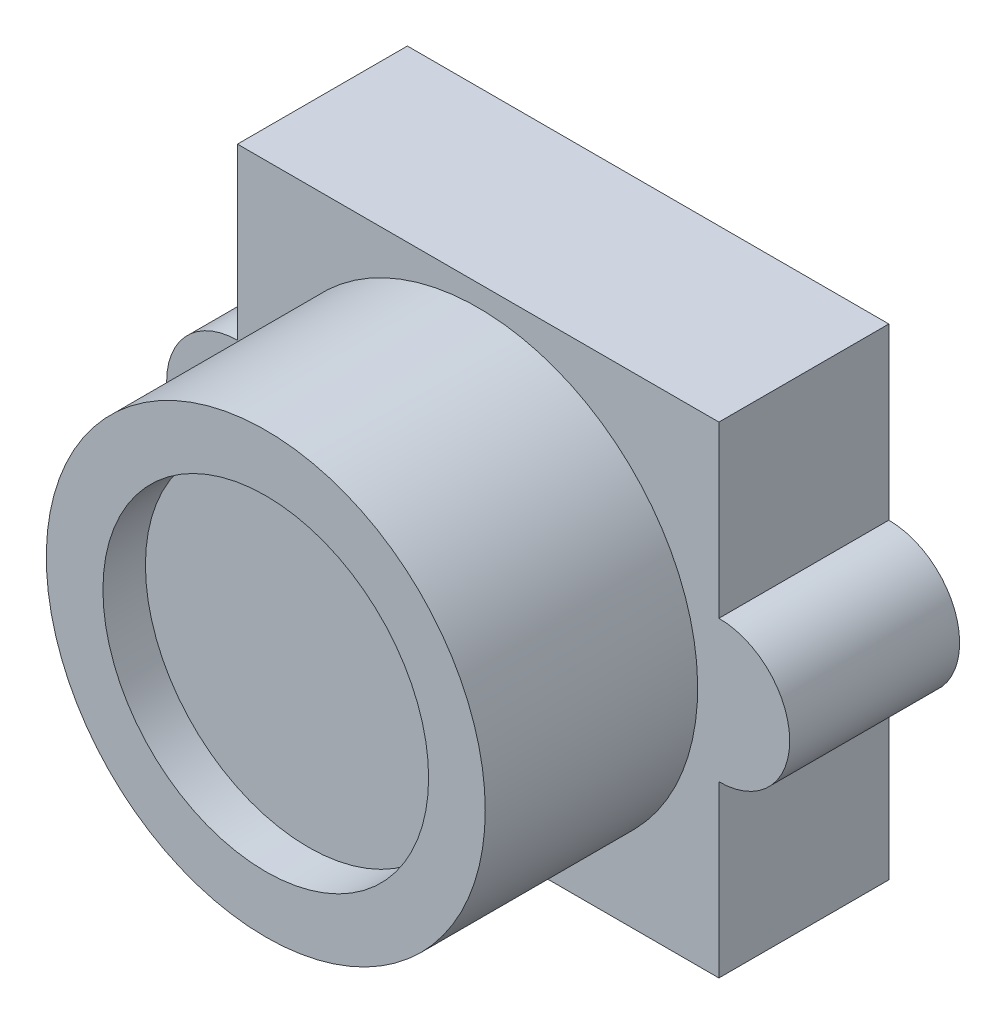
ISO-10303-21;
HEADER;
FILE_DESCRIPTION(('STEP AP214'),'2;1');
FILE_NAME('part.step','',(''),(''),'','','');
FILE_SCHEMA(('AUTOMOTIVE_DESIGN { 1 0 10303 214 1 1 1 1 }'));
ENDSEC;
DATA;
#1=APPLICATION_CONTEXT('core data for automotive mechanical design processes');
#2=APPLICATION_PROTOCOL_DEFINITION('international standard','automotive_design',2000,#1);
#3=PRODUCT_CONTEXT('',#1,'mechanical');
#4=PRODUCT('Part','Part','',(#3));
#5=PRODUCT_RELATED_PRODUCT_CATEGORY('part','',(#4));
#6=PRODUCT_DEFINITION_FORMATION('','',#4);
#7=PRODUCT_DEFINITION_CONTEXT('part definition',#1,'design');
#8=PRODUCT_DEFINITION('design','',#6,#7);
#9=PRODUCT_DEFINITION_SHAPE('','',#8);
#10=(LENGTH_UNIT() NAMED_UNIT(*) SI_UNIT(.MILLI.,.METRE.));
#11=(NAMED_UNIT(*) PLANE_ANGLE_UNIT() SI_UNIT($,.RADIAN.));
#12=(NAMED_UNIT(*) SI_UNIT($,.STERADIAN.) SOLID_ANGLE_UNIT());
#13=UNCERTAINTY_MEASURE_WITH_UNIT(LENGTH_MEASURE(1.E-05),#10,'distance_accuracy_value','');
#14=(GEOMETRIC_REPRESENTATION_CONTEXT(3) GLOBAL_UNCERTAINTY_ASSIGNED_CONTEXT((#13)) GLOBAL_UNIT_ASSIGNED_CONTEXT((#10,
#11,#12)) REPRESENTATION_CONTEXT('',''));
#15=CARTESIAN_POINT('',(0.,0.,0.));
#16=DIRECTION('',(0.,0.,1.));
#17=DIRECTION('',(1.,0.,0.));
#18=AXIS2_PLACEMENT_3D('',#15,#16,#17);
#19=CARTESIAN_POINT('',(0.,-2.9025,9.5275));
#20=DIRECTION('',(0.,0.,-1.));
#21=DIRECTION('',(-1.,0.,0.));
#22=AXIS2_PLACEMENT_3D('',#19,#20,#21);
#23=CYLINDRICAL_SURFACE('',#22,3.88125);
#24=CARTESIAN_POINT('',(0.,-2.9025,7.005));
#25=DIRECTION('',(0.,0.,1.));
#26=DIRECTION('',(1.,0.,0.));
#27=AXIS2_PLACEMENT_3D('',#24,#25,#26);
#28=CIRCLE('',#27,3.88125);
#29=CARTESIAN_POINT('',(3.88125,-2.9025,7.005));
#30=VERTEX_POINT('',#29);
#31=EDGE_CURVE('E54',#30,#30,#28,.T.);
#32=ORIENTED_EDGE('',*,*,#31,.T.);
#33=EDGE_LOOP('',(#32));
#34=FACE_BOUND('',#33,.T.);
#35=CARTESIAN_POINT('',(0.,-2.9025,8.505));
#36=DIRECTION('',(0.,0.,1.));
#37=DIRECTION('',(0.,-1.,0.));
#38=AXIS2_PLACEMENT_3D('',#35,#36,#37);
#39=CIRCLE('',#38,3.88125);
#40=CARTESIAN_POINT('',(0.,-6.78375,8.505));
#41=VERTEX_POINT('',#40);
#42=EDGE_CURVE('E11',#41,#41,#39,.T.);
#43=ORIENTED_EDGE('',*,*,#42,.F.);
#44=EDGE_LOOP('',(#43));
#45=FACE_BOUND('',#44,.T.);
#46=ADVANCED_FACE('F51',(#34,#45),#23,.T.);
#47=CARTESIAN_POINT('',(0.,-2.9025,7.005));
#48=DIRECTION('',(0.,0.,1.));
#49=DIRECTION('',(1.,0.,0.));
#50=AXIS2_PLACEMENT_3D('',#47,#48,#49);
#51=PLANE('',#50);
#52=ORIENTED_EDGE('',*,*,#31,.F.);
#53=EDGE_LOOP('',(#52));
#54=FACE_BOUND('',#53,.T.);
#55=ADVANCED_FACE('F65',(#54),#51,.F.);
#56=CARTESIAN_POINT('',(0.,-2.9025,8.505));
#57=DIRECTION('',(0.,0.,1.));
#58=DIRECTION('',(1.,0.,0.));
#59=AXIS2_PLACEMENT_3D('',#56,#57,#58);
#60=PLANE('',#59);
#61=ORIENTED_EDGE('',*,*,#42,.T.);
#62=EDGE_LOOP('',(#61));
#63=FACE_BOUND('',#62,.T.);
#64=ADVANCED_FACE('F67',(#63),#60,.T.);
#65=CLOSED_SHELL('',(#46,#55,#64));
#66=MANIFOLD_SOLID_BREP('B2',#65);
#67=CARTESIAN_POINT('',(-5.7375,-2.9025,4.455));
#68=DIRECTION('',(0.,0.,1.));
#69=DIRECTION('',(1.,0.,0.));
#70=AXIS2_PLACEMENT_3D('',#67,#68,#69);
#71=PLANE('',#70);
#72=CARTESIAN_POINT('',(0.,-2.9025,4.455));
#73=DIRECTION('',(0.,0.,1.));
#74=DIRECTION('',(0.,-1.,0.));
#75=AXIS2_PLACEMENT_3D('',#72,#73,#74);
#76=CIRCLE('',#75,5.23125);
#77=CARTESIAN_POINT('',(0.,-8.13375,4.455));
#78=VERTEX_POINT('',#77);
#79=EDGE_CURVE('E215',#78,#78,#76,.T.);
#80=ORIENTED_EDGE('',*,*,#79,.F.);
#81=EDGE_LOOP('',(#80));
#82=FACE_BOUND('',#81,.T.);
#83=DIRECTION('',(0.,1.,0.));
#84=VECTOR('',#83,1.);
#85=CARTESIAN_POINT('',(5.7375,-1.215,4.455));
#86=LINE('',#85,#84);
#87=CARTESIAN_POINT('',(5.7375,-1.215,4.455));
#88=VERTEX_POINT('',#87);
#89=CARTESIAN_POINT('',(5.7375,2.835,4.455));
#90=VERTEX_POINT('',#89);
#91=EDGE_CURVE('E238',#88,#90,#86,.T.);
#92=ORIENTED_EDGE('',*,*,#91,.T.);
#93=DIRECTION('',(-1.,0.,0.));
#94=VECTOR('',#93,1.);
#95=CARTESIAN_POINT('',(-5.7375,2.835,4.455));
#96=LINE('',#95,#94);
#97=CARTESIAN_POINT('',(-5.7375,2.835,4.455));
#98=VERTEX_POINT('',#97);
#99=EDGE_CURVE('E173',#90,#98,#96,.T.);
#100=ORIENTED_EDGE('',*,*,#99,.T.);
#101=DIRECTION('',(0.,-1.,0.));
#102=VECTOR('',#101,1.);
#103=CARTESIAN_POINT('',(-5.7375,-1.215,4.455));
#104=LINE('',#103,#102);
#105=CARTESIAN_POINT('',(-5.7375,-1.215,4.455));
#106=VERTEX_POINT('',#105);
#107=EDGE_CURVE('E242',#98,#106,#104,.T.);
#108=ORIENTED_EDGE('',*,*,#107,.T.);
#109=CARTESIAN_POINT('',(-5.7375,-2.9025,4.455));
#110=DIRECTION('',(0.,0.,1.));
#111=DIRECTION('',(1.,0.,0.));
#112=AXIS2_PLACEMENT_3D('',#109,#110,#111);
#113=CIRCLE('',#112,1.6875);
#114=CARTESIAN_POINT('',(-5.7375,-4.59,4.455));
#115=VERTEX_POINT('',#114);
#116=EDGE_CURVE('E249',#106,#115,#113,.T.);
#117=ORIENTED_EDGE('',*,*,#116,.T.);
#118=DIRECTION('',(0.,-1.,0.));
#119=VECTOR('',#118,1.);
#120=CARTESIAN_POINT('',(-5.7375,-8.64,4.455));
#121=LINE('',#120,#119);
#122=CARTESIAN_POINT('',(-5.7375,-8.64,4.455));
#123=VERTEX_POINT('',#122);
#124=EDGE_CURVE('E191',#115,#123,#121,.T.);
#125=ORIENTED_EDGE('',*,*,#124,.T.);
#126=DIRECTION('',(1.,0.,0.));
#127=VECTOR('',#126,1.);
#128=CARTESIAN_POINT('',(-5.7375,-8.64,4.455));
#129=LINE('',#128,#127);
#130=CARTESIAN_POINT('',(5.7375,-8.64,4.455));
#131=VERTEX_POINT('',#130);
#132=EDGE_CURVE('E186',#123,#131,#129,.T.);
#133=ORIENTED_EDGE('',*,*,#132,.T.);
#134=DIRECTION('',(0.,1.,0.));
#135=VECTOR('',#134,1.);
#136=CARTESIAN_POINT('',(5.7375,-8.64,4.455));
#137=LINE('',#136,#135);
#138=CARTESIAN_POINT('',(5.7375,-4.59,4.455));
#139=VERTEX_POINT('',#138);
#140=EDGE_CURVE('E189',#131,#139,#137,.T.);
#141=ORIENTED_EDGE('',*,*,#140,.T.);
#142=CARTESIAN_POINT('',(5.7375,-2.9025,4.455));
#143=DIRECTION('',(0.,0.,1.));
#144=DIRECTION('',(1.,0.,0.));
#145=AXIS2_PLACEMENT_3D('',#142,#143,#144);
#146=CIRCLE('',#145,1.6875);
#147=EDGE_CURVE('E130',#139,#88,#146,.T.);
#148=ORIENTED_EDGE('',*,*,#147,.T.);
#149=EDGE_LOOP('',(#92,#100,#108,#117,#125,#133,#141,#148));
#150=FACE_BOUND('',#149,.T.);
#151=ADVANCED_FACE('F111',(#82,#150),#71,.T.);
#152=CARTESIAN_POINT('',(-5.7375,2.835,4.455));
#153=DIRECTION('',(0.,-1.,0.));
#154=DIRECTION('',(0.,0.,-1.));
#155=AXIS2_PLACEMENT_3D('',#152,#153,#154);
#156=PLANE('',#155);
#157=DIRECTION('',(-1.,0.,0.));
#158=VECTOR('',#157,1.);
#159=CARTESIAN_POINT('',(-5.7375,2.835,0.405));
#160=LINE('',#159,#158);
#161=CARTESIAN_POINT('',(5.7375,2.835,0.405));
#162=VERTEX_POINT('',#161);
#163=CARTESIAN_POINT('',(-5.7375,2.835,0.405));
#164=VERTEX_POINT('',#163);
#165=EDGE_CURVE('E212',#162,#164,#160,.T.);
#166=ORIENTED_EDGE('',*,*,#165,.T.);
#167=DIRECTION('',(0.,0.,-1.));
#168=VECTOR('',#167,1.);
#169=CARTESIAN_POINT('',(-5.7375,2.835,4.455));
#170=LINE('',#169,#168);
#171=EDGE_CURVE('E216',#98,#164,#170,.T.);
#172=ORIENTED_EDGE('',*,*,#171,.F.);
#173=ORIENTED_EDGE('',*,*,#99,.F.);
#174=DIRECTION('',(0.,0.,-1.));
#175=VECTOR('',#174,1.);
#176=CARTESIAN_POINT('',(5.7375,2.835,4.455));
#177=LINE('',#176,#175);
#178=EDGE_CURVE('E213',#90,#162,#177,.T.);
#179=ORIENTED_EDGE('',*,*,#178,.T.);
#180=EDGE_LOOP('',(#166,#172,#173,#179));
#181=FACE_BOUND('',#180,.T.);
#182=ADVANCED_FACE('F263',(#181),#156,.F.);
#183=CARTESIAN_POINT('',(-5.7375,-1.215,4.455));
#184=DIRECTION('',(1.,0.,0.));
#185=DIRECTION('',(0.,1.,0.));
#186=AXIS2_PLACEMENT_3D('',#183,#184,#185);
#187=PLANE('',#186);
#188=DIRECTION('',(0.,-1.,0.));
#189=VECTOR('',#188,1.);
#190=CARTESIAN_POINT('',(-5.7375,-1.215,0.405));
#191=LINE('',#190,#189);
#192=CARTESIAN_POINT('',(-5.7375,-1.215,0.405));
#193=VERTEX_POINT('',#192);
#194=EDGE_CURVE('E219',#164,#193,#191,.T.);
#195=ORIENTED_EDGE('',*,*,#194,.T.);
#196=DIRECTION('',(0.,0.,-1.));
#197=VECTOR('',#196,1.);
#198=CARTESIAN_POINT('',(-5.7375,-1.215,4.455));
#199=LINE('',#198,#197);
#200=EDGE_CURVE('E222',#106,#193,#199,.T.);
#201=ORIENTED_EDGE('',*,*,#200,.F.);
#202=ORIENTED_EDGE('',*,*,#107,.F.);
#203=ORIENTED_EDGE('',*,*,#171,.T.);
#204=EDGE_LOOP('',(#195,#201,#202,#203));
#205=FACE_BOUND('',#204,.T.);
#206=ADVANCED_FACE('F262',(#205),#187,.F.);
#207=CARTESIAN_POINT('',(-5.7375,-2.9025,4.455));
#208=DIRECTION('',(0.,0.,-1.));
#209=DIRECTION('',(0.,1.,0.));
#210=AXIS2_PLACEMENT_3D('',#207,#208,#209);
#211=CYLINDRICAL_SURFACE('',#210,1.6875);
#212=CARTESIAN_POINT('',(-5.7375,-2.9025,0.405));
#213=DIRECTION('',(0.,0.,1.));
#214=DIRECTION('',(1.,0.,0.));
#215=AXIS2_PLACEMENT_3D('',#212,#213,#214);
#216=CIRCLE('',#215,1.6875);
#217=CARTESIAN_POINT('',(-5.7375,-4.59,0.405));
#218=VERTEX_POINT('',#217);
#219=EDGE_CURVE('E224',#193,#218,#216,.T.);
#220=ORIENTED_EDGE('',*,*,#219,.T.);
#221=DIRECTION('',(0.,0.,-1.));
#222=VECTOR('',#221,1.);
#223=CARTESIAN_POINT('',(-5.7375,-4.59,4.455));
#224=LINE('',#223,#222);
#225=EDGE_CURVE('E227',#115,#218,#224,.T.);
#226=ORIENTED_EDGE('',*,*,#225,.F.);
#227=ORIENTED_EDGE('',*,*,#116,.F.);
#228=ORIENTED_EDGE('',*,*,#200,.T.);
#229=EDGE_LOOP('',(#220,#226,#227,#228));
#230=FACE_BOUND('',#229,.T.);
#231=ADVANCED_FACE('F255',(#230),#211,.T.);
#232=CARTESIAN_POINT('',(-5.7375,-8.64,4.455));
#233=DIRECTION('',(1.,0.,0.));
#234=DIRECTION('',(0.,1.,0.));
#235=AXIS2_PLACEMENT_3D('',#232,#233,#234);
#236=PLANE('',#235);
#237=DIRECTION('',(0.,-1.,0.));
#238=VECTOR('',#237,1.);
#239=CARTESIAN_POINT('',(-5.7375,-8.64,0.405));
#240=LINE('',#239,#238);
#241=CARTESIAN_POINT('',(-5.7375,-8.64,0.405));
#242=VERTEX_POINT('',#241);
#243=EDGE_CURVE('E229',#218,#242,#240,.T.);
#244=ORIENTED_EDGE('',*,*,#243,.T.);
#245=DIRECTION('',(0.,0.,-1.));
#246=VECTOR('',#245,1.);
#247=CARTESIAN_POINT('',(-5.7375,-8.64,4.455));
#248=LINE('',#247,#246);
#249=EDGE_CURVE('E200',#123,#242,#248,.T.);
#250=ORIENTED_EDGE('',*,*,#249,.F.);
#251=ORIENTED_EDGE('',*,*,#124,.F.);
#252=ORIENTED_EDGE('',*,*,#225,.T.);
#253=EDGE_LOOP('',(#244,#250,#251,#252));
#254=FACE_BOUND('',#253,.T.);
#255=ADVANCED_FACE('F259',(#254),#236,.F.);
#256=CARTESIAN_POINT('',(-5.7375,-8.64,4.455));
#257=DIRECTION('',(0.,1.,0.));
#258=DIRECTION('',(0.,0.,1.));
#259=AXIS2_PLACEMENT_3D('',#256,#257,#258);
#260=PLANE('',#259);
#261=DIRECTION('',(1.,0.,0.));
#262=VECTOR('',#261,1.);
#263=CARTESIAN_POINT('',(-5.7375,-8.64,0.405));
#264=LINE('',#263,#262);
#265=CARTESIAN_POINT('',(5.7375,-8.64,0.405));
#266=VERTEX_POINT('',#265);
#267=EDGE_CURVE('E199',#242,#266,#264,.T.);
#268=ORIENTED_EDGE('',*,*,#267,.T.);
#269=DIRECTION('',(0.,0.,-1.));
#270=VECTOR('',#269,1.);
#271=CARTESIAN_POINT('',(5.7375,-8.64,4.455));
#272=LINE('',#271,#270);
#273=EDGE_CURVE('E196',#131,#266,#272,.T.);
#274=ORIENTED_EDGE('',*,*,#273,.F.);
#275=ORIENTED_EDGE('',*,*,#132,.F.);
#276=ORIENTED_EDGE('',*,*,#249,.T.);
#277=EDGE_LOOP('',(#268,#274,#275,#276));
#278=FACE_BOUND('',#277,.T.);
#279=ADVANCED_FACE('F197',(#278),#260,.F.);
#280=CARTESIAN_POINT('',(5.7375,-8.64,4.455));
#281=DIRECTION('',(-1.,0.,0.));
#282=DIRECTION('',(0.,-1.,0.));
#283=AXIS2_PLACEMENT_3D('',#280,#281,#282);
#284=PLANE('',#283);
#285=DIRECTION('',(0.,1.,0.));
#286=VECTOR('',#285,1.);
#287=CARTESIAN_POINT('',(5.7375,-8.64,0.405));
#288=LINE('',#287,#286);
#289=CARTESIAN_POINT('',(5.7375,-4.59,0.405));
#290=VERTEX_POINT('',#289);
#291=EDGE_CURVE('E159',#266,#290,#288,.T.);
#292=ORIENTED_EDGE('',*,*,#291,.T.);
#293=DIRECTION('',(0.,0.,-1.));
#294=VECTOR('',#293,1.);
#295=CARTESIAN_POINT('',(5.7375,-4.59,4.455));
#296=LINE('',#295,#294);
#297=EDGE_CURVE('E201',#139,#290,#296,.T.);
#298=ORIENTED_EDGE('',*,*,#297,.F.);
#299=ORIENTED_EDGE('',*,*,#140,.F.);
#300=ORIENTED_EDGE('',*,*,#273,.T.);
#301=EDGE_LOOP('',(#292,#298,#299,#300));
#302=FACE_BOUND('',#301,.T.);
#303=ADVANCED_FACE('F203',(#302),#284,.F.);
#304=CARTESIAN_POINT('',(5.7375,-2.9025,4.455));
#305=DIRECTION('',(0.,0.,-1.));
#306=DIRECTION('',(0.,1.,0.));
#307=AXIS2_PLACEMENT_3D('',#304,#305,#306);
#308=CYLINDRICAL_SURFACE('',#307,1.6875);
#309=CARTESIAN_POINT('',(5.7375,-2.9025,0.405));
#310=DIRECTION('',(0.,0.,1.));
#311=DIRECTION('',(1.,0.,0.));
#312=AXIS2_PLACEMENT_3D('',#309,#310,#311);
#313=CIRCLE('',#312,1.6875);
#314=CARTESIAN_POINT('',(5.7375,-1.215,0.405));
#315=VERTEX_POINT('',#314);
#316=EDGE_CURVE('E115',#290,#315,#313,.T.);
#317=ORIENTED_EDGE('',*,*,#316,.T.);
#318=DIRECTION('',(0.,0.,-1.));
#319=VECTOR('',#318,1.);
#320=CARTESIAN_POINT('',(5.7375,-1.215,4.455));
#321=LINE('',#320,#319);
#322=EDGE_CURVE('E205',#88,#315,#321,.T.);
#323=ORIENTED_EDGE('',*,*,#322,.F.);
#324=ORIENTED_EDGE('',*,*,#147,.F.);
#325=ORIENTED_EDGE('',*,*,#297,.T.);
#326=EDGE_LOOP('',(#317,#323,#324,#325));
#327=FACE_BOUND('',#326,.T.);
#328=ADVANCED_FACE('F235',(#327),#308,.T.);
#329=CARTESIAN_POINT('',(5.7375,-1.215,4.455));
#330=DIRECTION('',(-1.,0.,0.));
#331=DIRECTION('',(0.,0.,1.));
#332=AXIS2_PLACEMENT_3D('',#329,#330,#331);
#333=PLANE('',#332);
#334=DIRECTION('',(0.,1.,0.));
#335=VECTOR('',#334,1.);
#336=CARTESIAN_POINT('',(5.7375,-1.215,0.405));
#337=LINE('',#336,#335);
#338=EDGE_CURVE('E209',#315,#162,#337,.T.);
#339=ORIENTED_EDGE('',*,*,#338,.T.);
#340=ORIENTED_EDGE('',*,*,#178,.F.);
#341=ORIENTED_EDGE('',*,*,#91,.F.);
#342=ORIENTED_EDGE('',*,*,#322,.T.);
#343=EDGE_LOOP('',(#339,#340,#341,#342));
#344=FACE_BOUND('',#343,.T.);
#345=ADVANCED_FACE('F265',(#344),#333,.F.);
#346=CARTESIAN_POINT('',(-5.7375,-2.9025,0.405));
#347=DIRECTION('',(0.,0.,1.));
#348=DIRECTION('',(1.,0.,0.));
#349=AXIS2_PLACEMENT_3D('',#346,#347,#348);
#350=PLANE('',#349);
#351=ORIENTED_EDGE('',*,*,#338,.F.);
#352=ORIENTED_EDGE('',*,*,#316,.F.);
#353=ORIENTED_EDGE('',*,*,#291,.F.);
#354=ORIENTED_EDGE('',*,*,#267,.F.);
#355=ORIENTED_EDGE('',*,*,#243,.F.);
#356=ORIENTED_EDGE('',*,*,#219,.F.);
#357=ORIENTED_EDGE('',*,*,#194,.F.);
#358=ORIENTED_EDGE('',*,*,#165,.F.);
#359=EDGE_LOOP('',(#351,#352,#353,#354,#355,#356,#357,#358));
#360=FACE_BOUND('',#359,.T.);
#361=ADVANCED_FACE('F113',(#360),#350,.F.);
#362=CARTESIAN_POINT('',(0.,-2.9025,9.5175));
#363=DIRECTION('',(0.,0.,-1.));
#364=DIRECTION('',(-1.,0.,0.));
#365=AXIS2_PLACEMENT_3D('',#362,#363,#364);
#366=CYLINDRICAL_SURFACE('',#365,5.23125);
#367=CARTESIAN_POINT('',(0.,-2.9025,9.5175));
#368=DIRECTION('',(0.,0.,1.));
#369=DIRECTION('',(1.,0.,0.));
#370=AXIS2_PLACEMENT_3D('',#367,#368,#369);
#371=CIRCLE('',#370,5.23125);
#372=CARTESIAN_POINT('',(5.23125,-2.9025,9.5175));
#373=VERTEX_POINT('',#372);
#374=EDGE_CURVE('E121',#373,#373,#371,.T.);
#375=ORIENTED_EDGE('',*,*,#374,.F.);
#376=EDGE_LOOP('',(#375));
#377=FACE_BOUND('',#376,.T.);
#378=ORIENTED_EDGE('',*,*,#79,.T.);
#379=EDGE_LOOP('',(#378));
#380=FACE_BOUND('',#379,.T.);
#381=ADVANCED_FACE('F272',(#377,#380),#366,.T.);
#382=CARTESIAN_POINT('',(0.,-2.9025,9.5175));
#383=DIRECTION('',(0.,0.,1.));
#384=DIRECTION('',(1.,0.,0.));
#385=AXIS2_PLACEMENT_3D('',#382,#383,#384);
#386=PLANE('',#385);
#387=CARTESIAN_POINT('',(0.,-2.9025,9.5175));
#388=DIRECTION('',(0.,0.,1.));
#389=DIRECTION('',(1.,0.,0.));
#390=AXIS2_PLACEMENT_3D('',#387,#388,#389);
#391=CIRCLE('',#390,3.88125);
#392=CARTESIAN_POINT('',(3.88125,-2.9025,9.5175));
#393=VERTEX_POINT('',#392);
#394=EDGE_CURVE('E245',#393,#393,#391,.T.);
#395=ORIENTED_EDGE('',*,*,#394,.F.);
#396=EDGE_LOOP('',(#395));
#397=FACE_BOUND('',#396,.T.);
#398=ORIENTED_EDGE('',*,*,#374,.T.);
#399=EDGE_LOOP('',(#398));
#400=FACE_BOUND('',#399,.T.);
#401=ADVANCED_FACE('F279',(#397,#400),#386,.T.);
#402=CARTESIAN_POINT('',(0.,-2.9025,8.505));
#403=DIRECTION('',(0.,0.,1.));
#404=DIRECTION('',(0.,-1.,0.));
#405=AXIS2_PLACEMENT_3D('',#402,#403,#404);
#406=CYLINDRICAL_SURFACE('',#405,3.88125);
#407=ORIENTED_EDGE('',*,*,#394,.T.);
#408=EDGE_LOOP('',(#407));
#409=FACE_BOUND('',#408,.T.);
#410=CARTESIAN_POINT('',(0.,-2.9025,5.455));
#411=DIRECTION('',(0.,0.,1.));
#412=DIRECTION('',(1.,0.,0.));
#413=AXIS2_PLACEMENT_3D('',#410,#411,#412);
#414=CIRCLE('',#413,3.88125);
#415=CARTESIAN_POINT('',(3.88125,-2.9025,5.455));
#416=VERTEX_POINT('',#415);
#417=EDGE_CURVE('E49',#416,#416,#414,.T.);
#418=ORIENTED_EDGE('',*,*,#417,.F.);
#419=EDGE_LOOP('',(#418));
#420=FACE_BOUND('',#419,.T.);
#421=ADVANCED_FACE('F276',(#409,#420),#406,.F.);
#422=CARTESIAN_POINT('',(0.,-2.9025,5.455));
#423=DIRECTION('',(0.,0.,1.));
#424=DIRECTION('',(1.,0.,0.));
#425=AXIS2_PLACEMENT_3D('',#422,#423,#424);
#426=PLANE('',#425);
#427=ORIENTED_EDGE('',*,*,#417,.T.);
#428=EDGE_LOOP('',(#427));
#429=FACE_BOUND('',#428,.T.);
#430=ADVANCED_FACE('F278',(#429),#426,.T.);
#431=CLOSED_SHELL('',(#151,#182,#206,#231,#255,#279,#303,#328,#345,#361,#381,#401,#421,#430));
#432=MANIFOLD_SOLID_BREP('B6',#431);
#433=ADVANCED_BREP_SHAPE_REPRESENTATION('',(#18,#66,#432),#14);
#434=SHAPE_DEFINITION_REPRESENTATION(#9,#433);
ENDSEC;
END-ISO-10303-21;
